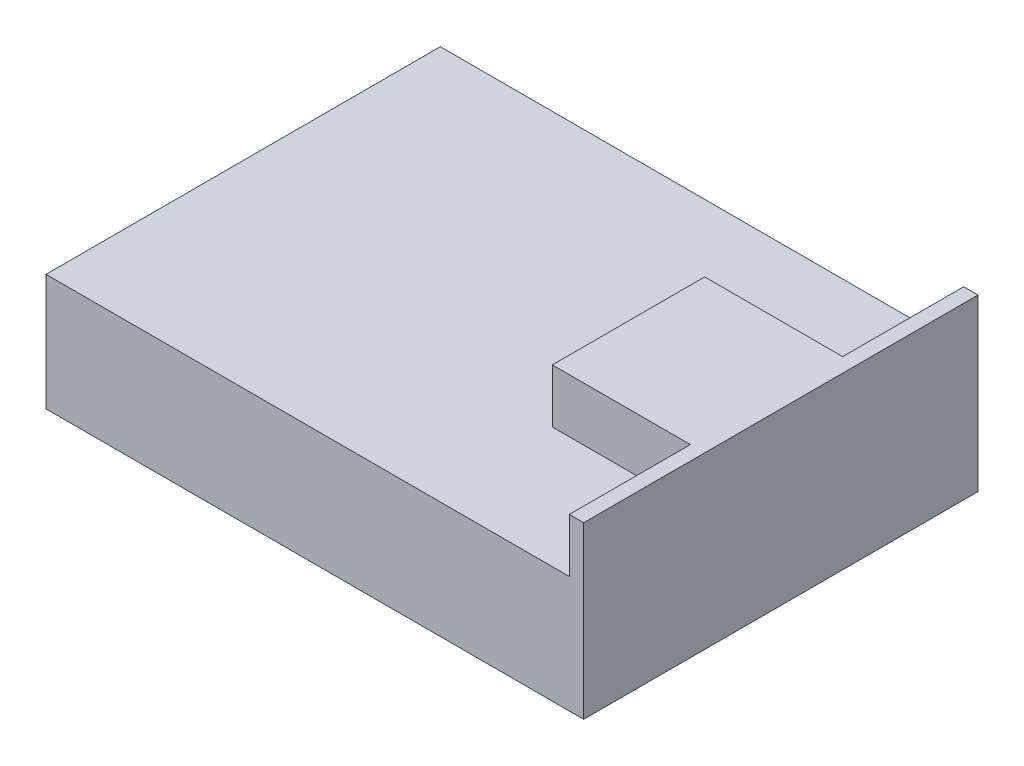
ISO-10303-21;
HEADER;
FILE_DESCRIPTION(('STEP AP214'),'2;1');
FILE_NAME('part.step','',(''),(''),'','','');
FILE_SCHEMA(('AUTOMOTIVE_DESIGN { 1 0 10303 214 1 1 1 1 }'));
ENDSEC;
DATA;
#1=APPLICATION_CONTEXT('core data for automotive mechanical design processes');
#2=APPLICATION_PROTOCOL_DEFINITION('international standard','automotive_design',2000,#1);
#3=PRODUCT_CONTEXT('',#1,'mechanical');
#4=PRODUCT('Part','Part','',(#3));
#5=PRODUCT_RELATED_PRODUCT_CATEGORY('part','',(#4));
#6=PRODUCT_DEFINITION_FORMATION('','',#4);
#7=PRODUCT_DEFINITION_CONTEXT('part definition',#1,'design');
#8=PRODUCT_DEFINITION('design','',#6,#7);
#9=PRODUCT_DEFINITION_SHAPE('','',#8);
#10=(LENGTH_UNIT() NAMED_UNIT(*) SI_UNIT(.MILLI.,.METRE.));
#11=(NAMED_UNIT(*) PLANE_ANGLE_UNIT() SI_UNIT($,.RADIAN.));
#12=(NAMED_UNIT(*) SI_UNIT($,.STERADIAN.) SOLID_ANGLE_UNIT());
#13=UNCERTAINTY_MEASURE_WITH_UNIT(LENGTH_MEASURE(1.E-05),#10,'distance_accuracy_value','');
#14=(GEOMETRIC_REPRESENTATION_CONTEXT(3) GLOBAL_UNCERTAINTY_ASSIGNED_CONTEXT((#13)) GLOBAL_UNIT_ASSIGNED_CONTEXT((#10,
#11,#12)) REPRESENTATION_CONTEXT('',''));
#15=CARTESIAN_POINT('',(0.,0.,0.));
#16=DIRECTION('',(0.,0.,1.));
#17=DIRECTION('',(1.,0.,0.));
#18=AXIS2_PLACEMENT_3D('',#15,#16,#17);
#19=CARTESIAN_POINT('',(28.4,13.,22.));
#20=DIRECTION('',(0.,-1.,0.));
#21=DIRECTION('',(0.,0.,-1.));
#22=AXIS2_PLACEMENT_3D('',#19,#20,#21);
#23=PLANE('',#22);
#24=DIRECTION('',(1.,0.,0.));
#25=VECTOR('',#24,1.);
#26=CARTESIAN_POINT('',(28.4,13.,8.5));
#27=LINE('',#26,#25);
#28=CARTESIAN_POINT('',(13.,13.,8.5));
#29=VERTEX_POINT('',#28);
#30=CARTESIAN_POINT('',(28.4,13.,8.5));
#31=VERTEX_POINT('',#30);
#32=EDGE_CURVE('E55',#29,#31,#27,.T.);
#33=ORIENTED_EDGE('',*,*,#32,.F.);
#34=DIRECTION('',(0.,0.,1.));
#35=VECTOR('',#34,1.);
#36=CARTESIAN_POINT('',(13.,13.,8.5));
#37=LINE('',#36,#35);
#38=CARTESIAN_POINT('',(13.,13.,-8.5));
#39=VERTEX_POINT('',#38);
#40=EDGE_CURVE('E60',#39,#29,#37,.T.);
#41=ORIENTED_EDGE('',*,*,#40,.F.);
#42=DIRECTION('',(-1.,0.,0.));
#43=VECTOR('',#42,1.);
#44=CARTESIAN_POINT('',(13.,13.,-8.5));
#45=LINE('',#44,#43);
#46=CARTESIAN_POINT('',(28.4,13.,-8.5));
#47=VERTEX_POINT('',#46);
#48=EDGE_CURVE('E134',#47,#39,#45,.T.);
#49=ORIENTED_EDGE('',*,*,#48,.F.);
#50=DIRECTION('',(0.,0.,-1.));
#51=VECTOR('',#50,1.);
#52=CARTESIAN_POINT('',(28.4,13.,22.));
#53=LINE('',#52,#51);
#54=CARTESIAN_POINT('',(28.4,13.,-22.));
#55=VERTEX_POINT('',#54);
#56=EDGE_CURVE('E160',#47,#55,#53,.T.);
#57=ORIENTED_EDGE('',*,*,#56,.T.);
#58=DIRECTION('',(-1.,0.,0.));
#59=VECTOR('',#58,1.);
#60=CARTESIAN_POINT('',(28.4,13.,-22.));
#61=LINE('',#60,#59);
#62=CARTESIAN_POINT('',(-30.,13.,-22.));
#63=VERTEX_POINT('',#62);
#64=EDGE_CURVE('E140',#55,#63,#61,.T.);
#65=ORIENTED_EDGE('',*,*,#64,.T.);
#66=DIRECTION('',(0.,0.,-1.));
#67=VECTOR('',#66,1.);
#68=CARTESIAN_POINT('',(-30.,13.,22.));
#69=LINE('',#68,#67);
#70=CARTESIAN_POINT('',(-30.,13.,22.));
#71=VERTEX_POINT('',#70);
#72=EDGE_CURVE('E154',#71,#63,#69,.T.);
#73=ORIENTED_EDGE('',*,*,#72,.F.);
#74=DIRECTION('',(-1.,0.,0.));
#75=VECTOR('',#74,1.);
#76=CARTESIAN_POINT('',(28.4,13.,22.));
#77=LINE('',#76,#75);
#78=CARTESIAN_POINT('',(28.4,13.,22.));
#79=VERTEX_POINT('',#78);
#80=EDGE_CURVE('E149',#79,#71,#77,.T.);
#81=ORIENTED_EDGE('',*,*,#80,.F.);
#82=EDGE_CURVE('E158',#79,#31,#53,.T.);
#83=ORIENTED_EDGE('',*,*,#82,.T.);
#84=EDGE_LOOP('',(#33,#41,#49,#57,#65,#73,#81,#83));
#85=FACE_BOUND('',#84,.T.);
#86=ADVANCED_FACE('F38',(#85),#23,.F.);
#87=CARTESIAN_POINT('',(28.4,19.,22.));
#88=DIRECTION('',(1.,0.,0.));
#89=DIRECTION('',(0.,0.,-1.));
#90=AXIS2_PLACEMENT_3D('',#87,#88,#89);
#91=PLANE('',#90);
#92=DIRECTION('',(0.,-1.,0.));
#93=VECTOR('',#92,1.);
#94=CARTESIAN_POINT('',(28.4,19.,8.5));
#95=LINE('',#94,#93);
#96=CARTESIAN_POINT('',(28.4,19.,8.5));
#97=VERTEX_POINT('',#96);
#98=EDGE_CURVE('E122',#97,#31,#95,.T.);
#99=ORIENTED_EDGE('',*,*,#98,.T.);
#100=ORIENTED_EDGE('',*,*,#82,.F.);
#101=DIRECTION('',(0.,-1.,0.));
#102=VECTOR('',#101,1.);
#103=CARTESIAN_POINT('',(28.4,19.,22.));
#104=LINE('',#103,#102);
#105=CARTESIAN_POINT('',(28.4,19.,22.));
#106=VERTEX_POINT('',#105);
#107=EDGE_CURVE('E146',#106,#79,#104,.T.);
#108=ORIENTED_EDGE('',*,*,#107,.F.);
#109=DIRECTION('',(0.,0.,-1.));
#110=VECTOR('',#109,1.);
#111=CARTESIAN_POINT('',(28.4,19.,22.));
#112=LINE('',#111,#110);
#113=EDGE_CURVE('E161',#106,#97,#112,.T.);
#114=ORIENTED_EDGE('',*,*,#113,.T.);
#115=EDGE_LOOP('',(#99,#100,#108,#114));
#116=FACE_BOUND('',#115,.T.);
#117=ADVANCED_FACE('F205',(#116),#91,.F.);
#118=DIRECTION('',(0.,-1.,0.));
#119=VECTOR('',#118,1.);
#120=CARTESIAN_POINT('',(28.4,19.,-8.5));
#121=LINE('',#120,#119);
#122=CARTESIAN_POINT('',(28.4,19.,-8.5));
#123=VERTEX_POINT('',#122);
#124=EDGE_CURVE('E142',#123,#47,#121,.T.);
#125=ORIENTED_EDGE('',*,*,#124,.F.);
#126=CARTESIAN_POINT('',(28.4,19.,-22.));
#127=VERTEX_POINT('',#126);
#128=EDGE_CURVE('E151',#123,#127,#112,.T.);
#129=ORIENTED_EDGE('',*,*,#128,.T.);
#130=DIRECTION('',(0.,-1.,0.));
#131=VECTOR('',#130,1.);
#132=CARTESIAN_POINT('',(28.4,19.,-22.));
#133=LINE('',#132,#131);
#134=EDGE_CURVE('E137',#127,#55,#133,.T.);
#135=ORIENTED_EDGE('',*,*,#134,.T.);
#136=ORIENTED_EDGE('',*,*,#56,.F.);
#137=EDGE_LOOP('',(#125,#129,#135,#136));
#138=FACE_BOUND('',#137,.T.);
#139=ADVANCED_FACE('F218',(#138),#91,.F.);
#140=CARTESIAN_POINT('',(30.,0.,22.));
#141=DIRECTION('',(1.,0.,0.));
#142=DIRECTION('',(0.,0.,-1.));
#143=AXIS2_PLACEMENT_3D('',#140,#141,#142);
#144=PLANE('',#143);
#145=DIRECTION('',(0.,0.,-1.));
#146=VECTOR('',#145,1.);
#147=CARTESIAN_POINT('',(30.,19.,22.));
#148=LINE('',#147,#146);
#149=CARTESIAN_POINT('',(30.,19.,22.));
#150=VERTEX_POINT('',#149);
#151=CARTESIAN_POINT('',(30.,19.,-22.));
#152=VERTEX_POINT('',#151);
#153=EDGE_CURVE('E157',#150,#152,#148,.T.);
#154=ORIENTED_EDGE('',*,*,#153,.F.);
#155=DIRECTION('',(0.,1.,0.));
#156=VECTOR('',#155,1.);
#157=CARTESIAN_POINT('',(30.,0.,22.));
#158=LINE('',#157,#156);
#159=CARTESIAN_POINT('',(30.,0.,22.));
#160=VERTEX_POINT('',#159);
#161=EDGE_CURVE('E11',#160,#150,#158,.T.);
#162=ORIENTED_EDGE('',*,*,#161,.F.);
#163=DIRECTION('',(0.,0.,-1.));
#164=VECTOR('',#163,1.);
#165=CARTESIAN_POINT('',(30.,0.,22.));
#166=LINE('',#165,#164);
#167=CARTESIAN_POINT('',(30.,0.,-22.));
#168=VERTEX_POINT('',#167);
#169=EDGE_CURVE('E163',#160,#168,#166,.T.);
#170=ORIENTED_EDGE('',*,*,#169,.T.);
#171=DIRECTION('',(0.,1.,0.));
#172=VECTOR('',#171,1.);
#173=CARTESIAN_POINT('',(30.,0.,-22.));
#174=LINE('',#173,#172);
#175=EDGE_CURVE('E42',#168,#152,#174,.T.);
#176=ORIENTED_EDGE('',*,*,#175,.T.);
#177=EDGE_LOOP('',(#154,#162,#170,#176));
#178=FACE_BOUND('',#177,.T.);
#179=ADVANCED_FACE('F40',(#178),#144,.T.);
#180=CARTESIAN_POINT('',(-30.,0.,22.));
#181=DIRECTION('',(0.,0.,1.));
#182=DIRECTION('',(1.,0.,0.));
#183=AXIS2_PLACEMENT_3D('',#180,#181,#182);
#184=PLANE('',#183);
#185=ORIENTED_EDGE('',*,*,#80,.T.);
#186=DIRECTION('',(0.,1.,0.));
#187=VECTOR('',#186,1.);
#188=CARTESIAN_POINT('',(-30.,0.,22.));
#189=LINE('',#188,#187);
#190=CARTESIAN_POINT('',(-30.,0.,22.));
#191=VERTEX_POINT('',#190);
#192=EDGE_CURVE('E47',#191,#71,#189,.T.);
#193=ORIENTED_EDGE('',*,*,#192,.F.);
#194=DIRECTION('',(1.,0.,0.));
#195=VECTOR('',#194,1.);
#196=CARTESIAN_POINT('',(-30.,0.,22.));
#197=LINE('',#196,#195);
#198=EDGE_CURVE('E173',#191,#160,#197,.T.);
#199=ORIENTED_EDGE('',*,*,#198,.T.);
#200=ORIENTED_EDGE('',*,*,#161,.T.);
#201=DIRECTION('',(1.,0.,0.));
#202=VECTOR('',#201,1.);
#203=CARTESIAN_POINT('',(-30.,19.,22.));
#204=LINE('',#203,#202);
#205=EDGE_CURVE('E167',#106,#150,#204,.T.);
#206=ORIENTED_EDGE('',*,*,#205,.F.);
#207=ORIENTED_EDGE('',*,*,#107,.T.);
#208=EDGE_LOOP('',(#185,#193,#199,#200,#206,#207));
#209=FACE_BOUND('',#208,.T.);
#210=ADVANCED_FACE('F196',(#209),#184,.T.);
#211=CARTESIAN_POINT('',(-30.,0.,-22.));
#212=DIRECTION('',(-1.,0.,0.));
#213=DIRECTION('',(0.,0.,1.));
#214=AXIS2_PLACEMENT_3D('',#211,#212,#213);
#215=PLANE('',#214);
#216=ORIENTED_EDGE('',*,*,#72,.T.);
#217=DIRECTION('',(0.,1.,0.));
#218=VECTOR('',#217,1.);
#219=CARTESIAN_POINT('',(-30.,0.,-22.));
#220=LINE('',#219,#218);
#221=CARTESIAN_POINT('',(-30.,0.,-22.));
#222=VERTEX_POINT('',#221);
#223=EDGE_CURVE('E183',#222,#63,#220,.T.);
#224=ORIENTED_EDGE('',*,*,#223,.F.);
#225=DIRECTION('',(0.,0.,1.));
#226=VECTOR('',#225,1.);
#227=CARTESIAN_POINT('',(-30.,0.,-22.));
#228=LINE('',#227,#226);
#229=EDGE_CURVE('E170',#222,#191,#228,.T.);
#230=ORIENTED_EDGE('',*,*,#229,.T.);
#231=ORIENTED_EDGE('',*,*,#192,.T.);
#232=EDGE_LOOP('',(#216,#224,#230,#231));
#233=FACE_BOUND('',#232,.T.);
#234=ADVANCED_FACE('F202',(#233),#215,.T.);
#235=CARTESIAN_POINT('',(30.,0.,-22.));
#236=DIRECTION('',(0.,0.,-1.));
#237=DIRECTION('',(-1.,0.,0.));
#238=AXIS2_PLACEMENT_3D('',#235,#236,#237);
#239=PLANE('',#238);
#240=ORIENTED_EDGE('',*,*,#64,.F.);
#241=ORIENTED_EDGE('',*,*,#134,.F.);
#242=DIRECTION('',(-1.,0.,0.));
#243=VECTOR('',#242,1.);
#244=CARTESIAN_POINT('',(30.,19.,-22.));
#245=LINE('',#244,#243);
#246=EDGE_CURVE('E178',#152,#127,#245,.T.);
#247=ORIENTED_EDGE('',*,*,#246,.F.);
#248=ORIENTED_EDGE('',*,*,#175,.F.);
#249=DIRECTION('',(-1.,0.,0.));
#250=VECTOR('',#249,1.);
#251=CARTESIAN_POINT('',(30.,0.,-22.));
#252=LINE('',#251,#250);
#253=EDGE_CURVE('E166',#168,#222,#252,.T.);
#254=ORIENTED_EDGE('',*,*,#253,.T.);
#255=ORIENTED_EDGE('',*,*,#223,.T.);
#256=EDGE_LOOP('',(#240,#241,#247,#248,#254,#255));
#257=FACE_BOUND('',#256,.T.);
#258=ADVANCED_FACE('F193',(#257),#239,.T.);
#259=CARTESIAN_POINT('',(0.,0.,0.));
#260=DIRECTION('',(0.,1.,0.));
#261=DIRECTION('',(0.,0.,1.));
#262=AXIS2_PLACEMENT_3D('',#259,#260,#261);
#263=PLANE('',#262);
#264=ORIENTED_EDGE('',*,*,#169,.F.);
#265=ORIENTED_EDGE('',*,*,#198,.F.);
#266=ORIENTED_EDGE('',*,*,#229,.F.);
#267=ORIENTED_EDGE('',*,*,#253,.F.);
#268=EDGE_LOOP('',(#264,#265,#266,#267));
#269=FACE_BOUND('',#268,.T.);
#270=ADVANCED_FACE('F199',(#269),#263,.F.);
#271=CARTESIAN_POINT('',(0.,19.,0.));
#272=DIRECTION('',(0.,1.,0.));
#273=DIRECTION('',(0.,0.,1.));
#274=AXIS2_PLACEMENT_3D('',#271,#272,#273);
#275=PLANE('',#274);
#276=ORIENTED_EDGE('',*,*,#113,.F.);
#277=ORIENTED_EDGE('',*,*,#205,.T.);
#278=ORIENTED_EDGE('',*,*,#153,.T.);
#279=ORIENTED_EDGE('',*,*,#246,.T.);
#280=ORIENTED_EDGE('',*,*,#128,.F.);
#281=DIRECTION('',(-1.,0.,0.));
#282=VECTOR('',#281,1.);
#283=CARTESIAN_POINT('',(13.,19.,-8.5));
#284=LINE('',#283,#282);
#285=CARTESIAN_POINT('',(13.,19.,-8.5));
#286=VERTEX_POINT('',#285);
#287=EDGE_CURVE('E125',#123,#286,#284,.T.);
#288=ORIENTED_EDGE('',*,*,#287,.T.);
#289=DIRECTION('',(0.,0.,1.));
#290=VECTOR('',#289,1.);
#291=CARTESIAN_POINT('',(13.,19.,8.5));
#292=LINE('',#291,#290);
#293=CARTESIAN_POINT('',(13.,19.,8.5));
#294=VERTEX_POINT('',#293);
#295=EDGE_CURVE('E126',#286,#294,#292,.T.);
#296=ORIENTED_EDGE('',*,*,#295,.T.);
#297=DIRECTION('',(1.,0.,0.));
#298=VECTOR('',#297,1.);
#299=CARTESIAN_POINT('',(28.4,19.,8.5));
#300=LINE('',#299,#298);
#301=EDGE_CURVE('E117',#294,#97,#300,.T.);
#302=ORIENTED_EDGE('',*,*,#301,.T.);
#303=EDGE_LOOP('',(#276,#277,#278,#279,#280,#288,#296,#302));
#304=FACE_BOUND('',#303,.T.);
#305=ADVANCED_FACE('F129',(#304),#275,.T.);
#306=CARTESIAN_POINT('',(13.,19.,8.5));
#307=DIRECTION('',(1.,0.,0.));
#308=DIRECTION('',(0.,0.,-1.));
#309=AXIS2_PLACEMENT_3D('',#306,#307,#308);
#310=PLANE('',#309);
#311=ORIENTED_EDGE('',*,*,#40,.T.);
#312=DIRECTION('',(0.,-1.,0.));
#313=VECTOR('',#312,1.);
#314=CARTESIAN_POINT('',(13.,19.,8.5));
#315=LINE('',#314,#313);
#316=EDGE_CURVE('E121',#294,#29,#315,.T.);
#317=ORIENTED_EDGE('',*,*,#316,.F.);
#318=ORIENTED_EDGE('',*,*,#295,.F.);
#319=DIRECTION('',(0.,-1.,0.));
#320=VECTOR('',#319,1.);
#321=CARTESIAN_POINT('',(13.,19.,-8.5));
#322=LINE('',#321,#320);
#323=EDGE_CURVE('E211',#286,#39,#322,.T.);
#324=ORIENTED_EDGE('',*,*,#323,.T.);
#325=EDGE_LOOP('',(#311,#317,#318,#324));
#326=FACE_BOUND('',#325,.T.);
#327=ADVANCED_FACE('F136',(#326),#310,.F.);
#328=CARTESIAN_POINT('',(28.4,19.,8.5));
#329=DIRECTION('',(0.,0.,-1.));
#330=DIRECTION('',(-1.,0.,0.));
#331=AXIS2_PLACEMENT_3D('',#328,#329,#330);
#332=PLANE('',#331);
#333=ORIENTED_EDGE('',*,*,#32,.T.);
#334=ORIENTED_EDGE('',*,*,#98,.F.);
#335=ORIENTED_EDGE('',*,*,#301,.F.);
#336=ORIENTED_EDGE('',*,*,#316,.T.);
#337=EDGE_LOOP('',(#333,#334,#335,#336));
#338=FACE_BOUND('',#337,.T.);
#339=ADVANCED_FACE('F119',(#338),#332,.F.);
#340=CARTESIAN_POINT('',(13.,19.,-8.5));
#341=DIRECTION('',(0.,0.,1.));
#342=DIRECTION('',(1.,0.,0.));
#343=AXIS2_PLACEMENT_3D('',#340,#341,#342);
#344=PLANE('',#343);
#345=ORIENTED_EDGE('',*,*,#48,.T.);
#346=ORIENTED_EDGE('',*,*,#323,.F.);
#347=ORIENTED_EDGE('',*,*,#287,.F.);
#348=ORIENTED_EDGE('',*,*,#124,.T.);
#349=EDGE_LOOP('',(#345,#346,#347,#348));
#350=FACE_BOUND('',#349,.T.);
#351=ADVANCED_FACE('F215',(#350),#344,.F.);
#352=CLOSED_SHELL('',(#86,#117,#139,#179,#210,#234,#258,#270,#305,#327,#339,#351));
#353=MANIFOLD_SOLID_BREP('B2',#352);
#354=ADVANCED_BREP_SHAPE_REPRESENTATION('',(#18,#353),#14);
#355=SHAPE_DEFINITION_REPRESENTATION(#9,#354);
ENDSEC;
END-ISO-10303-21;
